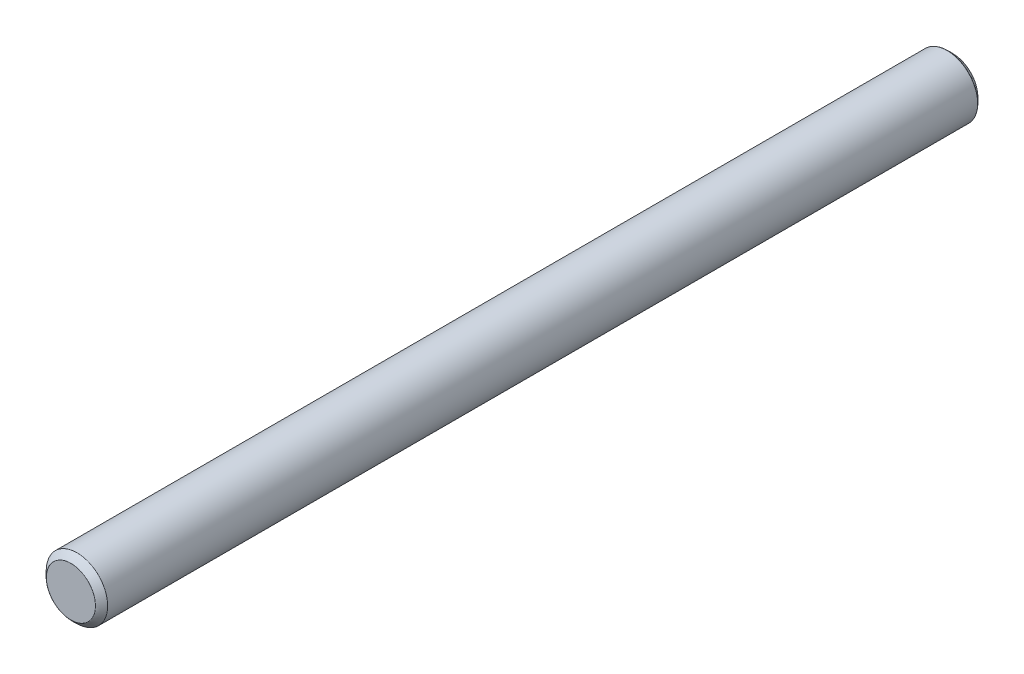
ISO-10303-21;
HEADER;
FILE_DESCRIPTION(('STEP AP214'),'2;1');
FILE_NAME('part.step','',(''),(''),'','','');
FILE_SCHEMA(('AUTOMOTIVE_DESIGN { 1 0 10303 214 1 1 1 1 }'));
ENDSEC;
DATA;
#1=APPLICATION_CONTEXT('core data for automotive mechanical design processes');
#2=APPLICATION_PROTOCOL_DEFINITION('international standard','automotive_design',2000,#1);
#3=PRODUCT_CONTEXT('',#1,'mechanical');
#4=PRODUCT('Part','Part','',(#3));
#5=PRODUCT_RELATED_PRODUCT_CATEGORY('part','',(#4));
#6=PRODUCT_DEFINITION_FORMATION('','',#4);
#7=PRODUCT_DEFINITION_CONTEXT('part definition',#1,'design');
#8=PRODUCT_DEFINITION('design','',#6,#7);
#9=PRODUCT_DEFINITION_SHAPE('','',#8);
#10=(LENGTH_UNIT() NAMED_UNIT(*) SI_UNIT(.MILLI.,.METRE.));
#11=(NAMED_UNIT(*) PLANE_ANGLE_UNIT() SI_UNIT($,.RADIAN.));
#12=(NAMED_UNIT(*) SI_UNIT($,.STERADIAN.) SOLID_ANGLE_UNIT());
#13=UNCERTAINTY_MEASURE_WITH_UNIT(LENGTH_MEASURE(1.E-05),#10,'distance_accuracy_value','');
#14=(GEOMETRIC_REPRESENTATION_CONTEXT(3) GLOBAL_UNCERTAINTY_ASSIGNED_CONTEXT((#13)) GLOBAL_UNIT_ASSIGNED_CONTEXT((#10,
#11,#12)) REPRESENTATION_CONTEXT('',''));
#15=CARTESIAN_POINT('',(0.,0.,0.));
#16=DIRECTION('',(0.,0.,1.));
#17=DIRECTION('',(1.,0.,0.));
#18=AXIS2_PLACEMENT_3D('',#15,#16,#17);
#19=CARTESIAN_POINT('',(21.0000003129244,21.0000003129244,0.));
#20=DIRECTION('',(0.,0.,1.));
#21=DIRECTION('',(1.,0.,0.));
#22=AXIS2_PLACEMENT_3D('',#19,#20,#21);
#23=PLANE('',#22);
#24=CARTESIAN_POINT('',(19.0000003129238,21.0000003129243,0.));
#25=CARTESIAN_POINT('',(19.0000003129238,20.7008024610567,0.));
#26=CARTESIAN_POINT('',(19.1368379382517,20.1028116455905,0.));
#27=CARTESIAN_POINT('',(19.7103267658874,19.3826510640446,0.));
#28=CARTESIAN_POINT('',(20.5397550038727,18.9836402178783,0.));
#29=CARTESIAN_POINT('',(21.4603736935143,18.9832834513304,0.));
#30=CARTESIAN_POINT('',(22.2895292086346,19.3828951034981,0.));
#31=CARTESIAN_POINT('',(22.8637622890839,20.1025187758078,0.));
#32=CARTESIAN_POINT('',(23.0681217289901,20.9999654872141,0.));
#33=CARTESIAN_POINT('',(22.86393551835,21.8976061113134,0.));
#34=CARTESIAN_POINT('',(22.2894703279759,22.6168740574728,0.));
#35=CARTESIAN_POINT('',(21.4603797789991,23.0167114218665,0.));
#36=CARTESIAN_POINT('',(20.5398701973034,23.0162109402336,0.));
#37=CARTESIAN_POINT('',(19.7103040674624,22.6174206357461,0.));
#38=CARTESIAN_POINT('',(19.1368244429707,21.8972478306236,0.));
#39=CARTESIAN_POINT('',(19.0000003129244,21.2991981647919,0.));
#40=CARTESIAN_POINT('',(19.0000003129238,21.0000003129243,0.));
#41=(BOUNDED_CURVE() B_SPLINE_CURVE(3,(#24,#25,#26,#27,#28,#29,#30,#31,#32,#33,#34,#35,#36,#37,
#38,#39,#40),.UNSPECIFIED.,.T.,.F.) B_SPLINE_CURVE_WITH_KNOTS((4,1,1,1,1,1,1,1,1,1,1,1,1,1,4),
(0.,0.0893513490095413,0.178702698019083,0.268054047028624,0.357405396038165,0.446756745047706,
0.536108094057248,0.625459443066789,0.71481079207633,0.804162141085872,0.893513490095413,
0.982864839104954,1.0722161881145,1.16156753712404,1.25091888613358),
.UNSPECIFIED.) CURVE() GEOMETRIC_REPRESENTATION_ITEM() RATIONAL_B_SPLINE_CURVE((1.,1.,1.,1.,1.,
1.,1.,1.,1.,1.,1.,1.,1.,1.,1.,1.,1.)) REPRESENTATION_ITEM(''));
#42=CARTESIAN_POINT('',(19.0000003129238,21.0000003129243,0.));
#43=VERTEX_POINT('',#42);
#44=EDGE_CURVE('E11',#43,#43,#41,.T.);
#45=ORIENTED_EDGE('',*,*,#44,.F.);
#46=EDGE_LOOP('',(#45));
#47=FACE_BOUND('',#46,.T.);
#48=ADVANCED_FACE('F17',(#47),#23,.F.);
#49=CARTESIAN_POINT('',(18.5000003129244,21.0000003129244,0.5));
#50=CARTESIAN_POINT('',(18.5000003129244,20.6260029980899,0.5));
#51=CARTESIAN_POINT('',(18.6710473445843,19.8785144787572,0.5));
#52=CARTESIAN_POINT('',(19.3879083791285,18.9783137518249,0.5));
#53=CARTESIAN_POINT('',(20.4246936766101,18.479550194117,0.5));
#54=CARTESIAN_POINT('',(21.5754670386619,18.479104235932,0.5));
#55=CARTESIAN_POINT('',(22.6119114325621,18.9786188011417,0.5));
#56=CARTESIAN_POINT('',(23.3297027831237,19.8781483915288,0.5));
#57=CARTESIAN_POINT('',(23.5851520830064,20.9999567807866,0.5));
#58=CARTESIAN_POINT('',(23.3299193197063,22.1220075609106,0.5));
#59=CARTESIAN_POINT('',(22.6118378317387,23.0210924936098,0.5));
#60=CARTESIAN_POINT('',(21.5754746455178,23.5208891991021,0.5));
#61=CARTESIAN_POINT('',(20.4248376683982,23.5202635970609,0.5));
#62=CARTESIAN_POINT('',(19.3878800060969,23.0217757164516,0.5));
#63=CARTESIAN_POINT('',(18.6710304754823,22.1215597100484,0.5));
#64=CARTESIAN_POINT('',(18.5000003129244,21.3739976277588,0.5));
#65=CARTESIAN_POINT('',(18.5000003129244,21.0000003129244,0.5));
#66=CARTESIAN_POINT('',(18.5000003129244,21.0000003129244,0.493265649702988));
#67=CARTESIAN_POINT('',(18.5000003129244,20.6263840707956,0.493265649702988));
#68=CARTESIAN_POINT('',(18.671314938168,19.8791590527189,0.493265649702988));
#69=CARTESIAN_POINT('',(19.3883444127851,18.979466115803,0.493265649702987));
#70=CARTESIAN_POINT('',(20.4244140424163,18.4808899410724,0.493265649702987));
#71=CARTESIAN_POINT('',(21.5748857404242,18.480618990635,0.493265649702987));
#72=CARTESIAN_POINT('',(22.6106749790101,18.9795685281252,0.493265649702987));
#73=CARTESIAN_POINT('',(23.3280138629895,19.8788332526671,0.493265649702987));
#74=CARTESIAN_POINT('',(23.5836564186189,20.9999810500944,0.493265649702987));
#75=CARTESIAN_POINT('',(23.3282441566848,22.1212878624697,0.493265649702987));
#76=CARTESIAN_POINT('',(22.6108504037107,23.0200236085121,0.493265649702986));
#77=CARTESIAN_POINT('',(21.5747476839077,23.519264272477,0.493265649702986));
#78=CARTESIAN_POINT('',(20.4246638664434,23.5189357417867,0.493265649702986));
#79=CARTESIAN_POINT('',(19.3882174119512,23.0205025962556,0.493265649702986));
#80=CARTESIAN_POINT('',(18.6712531071615,22.1208706536084,0.493265649702986));
#81=CARTESIAN_POINT('',(18.5000003129244,21.3736165550532,0.493265649702986));
#82=CARTESIAN_POINT('',(18.5000003129244,21.0000003129244,0.493265649702988));
#83=CARTESIAN_POINT('',(18.5236598250269,21.0000003129244,0.450318965022027));
#84=CARTESIAN_POINT('',(18.5236598250269,20.6293649869712,0.450318965022027));
#85=CARTESIAN_POINT('',(18.692963494455,19.888827852217,0.450318965022028));
#86=CARTESIAN_POINT('',(19.4029618609725,18.9969099939135,0.450318965022026));
#87=CARTESIAN_POINT('',(20.4302684796254,18.5027793812064,0.450318965022025));
#88=CARTESIAN_POINT('',(21.5702916187756,18.5022561501092,0.450318965022024));
#89=CARTESIAN_POINT('',(22.5972323820784,18.9973065153958,0.450318965022023));
#90=CARTESIAN_POINT('',(23.308441389072,19.888446469609,0.450318965022024));
#91=CARTESIAN_POINT('',(23.5613831759737,20.9999458916222,0.450318965022023));
#92=CARTESIAN_POINT('',(23.3086494703154,22.111724235042,0.450318965022023));
#93=CARTESIAN_POINT('',(22.5970435176181,23.0024630041963,0.450318965022022));
#94=CARTESIAN_POINT('',(21.5703669826366,23.4977886551724,0.450318965022021));
#95=CARTESIAN_POINT('',(20.4303618273069,23.4970306407079,0.450318965022021));
#96=CARTESIAN_POINT('',(19.4029796830664,23.0032348644094,0.450318965022021));
#97=CARTESIAN_POINT('',(18.6929677217708,22.1112663539273,0.45031896502202));
#98=CARTESIAN_POINT('',(18.523659825027,21.3706356388776,0.45031896502202));
#99=CARTESIAN_POINT('',(18.5236598250269,21.0000003129244,0.450318965022027));
#100=CARTESIAN_POINT('',(18.7488163916972,21.0000003129243,0.214278353263149));
#101=CARTESIAN_POINT('',(18.7488163916972,20.6632302218525,0.214278353263149));
#102=CARTESIAN_POINT('',(18.9028429567965,19.9901397521042,0.214278353263151));
#103=CARTESIAN_POINT('',(19.5483594064419,19.1795389282869,0.214278353263145));
#104=CARTESIAN_POINT('',(20.4819485135029,18.7304177923445,0.214278353263145));
#105=CARTESIAN_POINT('',(21.5181858634594,18.73001833392,0.214278353263141));
#106=CARTESIAN_POINT('',(22.4514687272071,19.1798111680745,0.21427835326314));
#107=CARTESIAN_POINT('',(23.0978153975937,19.9898105871399,0.214278353263141));
#108=CARTESIAN_POINT('',(23.3278430759055,20.9999614067024,0.214278353263139));
#109=CARTESIAN_POINT('',(23.0980105493306,22.0103294851565,0.214278353263139));
#110=CARTESIAN_POINT('',(22.4514054613194,22.8199274826304,0.214278353263137));
#111=CARTESIAN_POINT('',(21.5181909527529,23.2699744852586,0.214278353263136));
#112=CARTESIAN_POINT('',(20.4820794533847,23.2694147375436,0.214278353263135));
#113=CARTESIAN_POINT('',(19.548332665267,22.820540238367,0.214278353263135));
#114=CARTESIAN_POINT('',(18.9028272232094,22.00992657763,0.214278353263133));
#115=CARTESIAN_POINT('',(18.7488163916974,21.3367704039963,0.214278353263133));
#116=CARTESIAN_POINT('',(18.7488163916972,21.0000003129243,0.214278353263149));
#117=CARTESIAN_POINT('',(18.9126541124237,21.0000003129243,0.0624472864865153));
#118=CARTESIAN_POINT('',(18.9126541124237,20.6878314682075,0.0624472864865157));
#119=CARTESIAN_POINT('',(19.0555352066121,20.0637908555202,0.0624472864865174));
#120=CARTESIAN_POINT('',(19.6541124607825,19.3123064246963,0.0624472864865128));
#121=CARTESIAN_POINT('',(20.5195842885476,18.8959166966965,0.062447286486512));
#122=CARTESIAN_POINT('',(21.4803333304375,18.8955883934135,0.0624472864865088));
#123=CARTESIAN_POINT('',(22.3455357539319,19.3125101242643,0.0624472864865081));
#124=CARTESIAN_POINT('',(22.9447335005759,20.0634953343182,0.0624472864865088));
#125=CARTESIAN_POINT('',(23.1580665876456,20.9999700741472,0.0624472864865077));
#126=CARTESIAN_POINT('',(22.9449177575668,21.9366262121409,0.0624472864865075));
#127=CARTESIAN_POINT('',(22.3455369742626,22.6872189392819,0.0624472864865057));
#128=CARTESIAN_POINT('',(21.4803030224549,23.104378501475,0.0624472864865049));
#129=CARTESIAN_POINT('',(20.5197311477327,23.1039309264867,0.0624472864865042));
#130=CARTESIAN_POINT('',(19.6540639492941,22.6877379882818,0.0624472864865044));
#131=CARTESIAN_POINT('',(19.0555098063449,21.9362599959242,0.0624472864865027));
#132=CARTESIAN_POINT('',(18.9126541124242,21.3121691576412,0.0624472864865024));
#133=CARTESIAN_POINT('',(18.9126541124237,21.0000003129243,0.0624472864865153));
#134=CARTESIAN_POINT('',(18.9801906978812,21.0000003129243,0.00766778343289825));
#135=CARTESIAN_POINT('',(18.9801906978812,20.6978546538713,0.00766778343289845));
#136=CARTESIAN_POINT('',(19.1183946912095,20.0939517036443,0.00766778343289932));
#137=CARTESIAN_POINT('',(19.6975707505,19.3666789774475,0.00766778343289697));
#138=CARTESIAN_POINT('',(20.5351848492648,18.9637237207908,0.00766778343289658));
#139=CARTESIAN_POINT('',(21.4649096693812,18.963370626152,0.00766778343289498));
#140=CARTESIAN_POINT('',(22.3022508355027,19.3669170908698,0.00766778343289464));
#141=CARTESIAN_POINT('',(22.8821529546303,20.0936575917911,0.00766778343289497));
#142=CARTESIAN_POINT('',(23.0885444923939,20.999966141515,0.00766778343289446));
#143=CARTESIAN_POINT('',(22.8823284661221,21.906467091754,0.00766778343289431));
#144=CARTESIAN_POINT('',(22.3022016247976,22.632844871376,0.00766778343289341));
#145=CARTESIAN_POINT('',(21.4649098177277,23.0366196539455,0.00766778343289301));
#146=CARTESIAN_POINT('',(20.5353055411066,23.0361264464894,0.00766778343289268));
#147=CARTESIAN_POINT('',(19.6975437664382,22.633388454408,0.00766778343289278));
#148=CARTESIAN_POINT('',(19.1183792110389,21.9061065239894,0.0076677834328919));
#149=CARTESIAN_POINT('',(18.9801906978818,21.3021459719774,0.00766778343289177));
#150=CARTESIAN_POINT('',(18.9801906978812,21.0000003129243,0.00766778343289825));
#151=CARTESIAN_POINT('',(18.9966331377753,21.0000003129243,0.));
#152=CARTESIAN_POINT('',(18.9966331377753,20.7003345813642,0.));
#153=CARTESIAN_POINT('',(19.1337263127628,20.1013617825753,0.));
#154=CARTESIAN_POINT('',(19.7081965035942,19.3800365135426,0.));
#155=CARTESIAN_POINT('',(20.53895383644,18.9803715240939,0.));
#156=CARTESIAN_POINT('',(21.4610940918526,18.9800306192266,0.));
#157=CARTESIAN_POINT('',(22.2915839348698,19.3802619025489,0.));
#158=CARTESIAN_POINT('',(22.8667412251483,20.1010722093858,0.));
#159=CARTESIAN_POINT('',(23.0714629009181,20.9999677115056,0.));
#160=CARTESIAN_POINT('',(22.8669160401415,21.8990496099246,0.));
#161=CARTESIAN_POINT('',(22.2915483799859,22.6194956599697,0.));
#162=CARTESIAN_POINT('',(21.4610864855708,23.019953880822,0.));
#163=CARTESIAN_POINT('',(20.5390791790543,23.0194805009823,0.));
#164=CARTESIAN_POINT('',(19.7081644894037,22.6200239468188,0.));
#165=CARTESIAN_POINT('',(19.1337085653621,21.898693608417,0.));
#166=CARTESIAN_POINT('',(18.9966331377759,21.2996660444845,0.));
#167=CARTESIAN_POINT('',(18.9966331377753,21.0000003129243,0.));
#168=CARTESIAN_POINT('',(19.0000003129238,21.0000003129243,0.));
#169=CARTESIAN_POINT('',(19.0000003129238,20.7008024610567,0.));
#170=CARTESIAN_POINT('',(19.1368379382517,20.1028116455905,0.));
#171=CARTESIAN_POINT('',(19.7103267658874,19.3826510640446,0.));
#172=CARTESIAN_POINT('',(20.5397550038727,18.9836402178783,0.));
#173=CARTESIAN_POINT('',(21.4603736935143,18.9832834513304,0.));
#174=CARTESIAN_POINT('',(22.2895292086346,19.3828951034981,0.));
#175=CARTESIAN_POINT('',(22.8637622890839,20.1025187758078,0.));
#176=CARTESIAN_POINT('',(23.0681217289901,20.9999654872141,0.));
#177=CARTESIAN_POINT('',(22.86393551835,21.8976061113134,0.));
#178=CARTESIAN_POINT('',(22.2894703279759,22.6168740574728,0.));
#179=CARTESIAN_POINT('',(21.4603797789991,23.0167114218665,0.));
#180=CARTESIAN_POINT('',(20.5398701973034,23.0162109402336,0.));
#181=CARTESIAN_POINT('',(19.7103040674624,22.6174206357461,0.));
#182=CARTESIAN_POINT('',(19.1368244429707,21.8972478306236,0.));
#183=CARTESIAN_POINT('',(19.0000003129244,21.2991981647919,0.));
#184=CARTESIAN_POINT('',(19.0000003129238,21.0000003129243,0.));
#185=(BOUNDED_SURFACE() B_SPLINE_SURFACE(3,3,((#49,#50,#51,#52,#53,#54,#55,#56,#57,#58,#59,#60,
#61,#62,#63,#64,#65),(#66,#67,#68,#69,#70,#71,#72,#73,#74,#75,#76,#77,#78,#79,#80,#81,#82),(#83,
#84,#85,#86,#87,#88,#89,#90,#91,#92,#93,#94,#95,#96,#97,#98,#99),(#100,#101,#102,#103,#104,#105,
#106,#107,#108,#109,#110,#111,#112,#113,#114,#115,#116),(#117,#118,#119,#120,#121,#122,#123,
#124,#125,#126,#127,#128,#129,#130,#131,#132,#133),(#134,#135,#136,#137,#138,#139,#140,#141,
#142,#143,#144,#145,#146,#147,#148,#149,#150),(#151,#152,#153,#154,#155,#156,#157,#158,#159,
#160,#161,#162,#163,#164,#165,#166,#167),(#168,#169,#170,#171,#172,#173,#174,#175,#176,#177,
#178,#179,#180,#181,#182,#183,#184)),.UNSPECIFIED.,.F.,.T.,.F.) B_SPLINE_SURFACE_WITH_KNOTS((4,
1,1,1,1,4),(4,1,1,1,1,1,1,1,1,1,1,1,1,1,4),(0.,0.285714285714286,0.571428571428571,
0.678571428571428,0.857142857142857,1.),(0.,0.0893513490095413,0.178702698019083,
0.268054047028624,0.357405396038165,0.446756745047706,0.536108094057248,0.625459443066789,
0.71481079207633,0.804162141085872,0.893513490095413,0.982864839104954,1.0722161881145,
1.16156753712404,1.25091888613358),
.UNSPECIFIED.) GEOMETRIC_REPRESENTATION_ITEM() RATIONAL_B_SPLINE_SURFACE(((1.,1.,1.,1.,1.,1.,1.,
1.,1.,1.,1.,1.,1.,1.,1.,1.,1.),(1.,1.,1.,1.,1.,1.,1.,1.,1.,1.,1.,1.,1.,1.,1.,1.,1.),(1.,1.,1.,
1.,1.,1.,1.,1.,1.,1.,1.,1.,1.,1.,1.,1.,1.),(1.,1.,1.,1.,1.,1.,1.,1.,1.,1.,1.,1.,1.,1.,1.,1.,1.),
(1.,1.,1.,1.,1.,1.,1.,1.,1.,1.,1.,1.,1.,1.,1.,1.,1.),(1.,1.,1.,1.,1.,1.,1.,1.,1.,1.,1.,1.,1.,1.,
1.,1.,1.),(1.,1.,1.,1.,1.,1.,1.,1.,1.,1.,1.,1.,1.,1.,1.,1.,1.),(1.,1.,1.,1.,1.,1.,1.,1.,1.,1.,
1.,1.,1.,1.,1.,1.,1.))) REPRESENTATION_ITEM('') SURFACE());
#186=CARTESIAN_POINT('',(18.5000003129244,21.0000003129244,0.5));
#187=CARTESIAN_POINT('',(18.5000003129244,21.0000003129244,0.493265649702988));
#188=CARTESIAN_POINT('',(18.5236598250269,21.0000003129244,0.450318965022027));
#189=CARTESIAN_POINT('',(18.7488163916972,21.0000003129243,0.214278353263149));
#190=CARTESIAN_POINT('',(18.9126541124237,21.0000003129243,0.0624472864865153));
#191=CARTESIAN_POINT('',(18.9801906978812,21.0000003129243,0.00766778343289825));
#192=CARTESIAN_POINT('',(18.9966331377753,21.0000003129243,0.));
#193=CARTESIAN_POINT('',(19.0000003129238,21.0000003129243,0.));
#194=(BOUNDED_CURVE() B_SPLINE_CURVE(3,(#186,#187,#188,#189,#190,#191,#192,#193),.UNSPECIFIED.,
.F.,.F.) B_SPLINE_CURVE_WITH_KNOTS((4,1,1,1,1,4),(0.,0.285714285714286,0.571428571428571,
0.678571428571428,0.857142857142857,1.),
.UNSPECIFIED.) CURVE() GEOMETRIC_REPRESENTATION_ITEM() RATIONAL_B_SPLINE_CURVE((1.,1.,1.,1.,1.,
1.,1.,1.)) REPRESENTATION_ITEM(''));
#195=CARTESIAN_POINT('',(18.5000003129244,21.0000003129244,0.5));
#196=VERTEX_POINT('',#195);
#197=EDGE_CURVE('E32',#196,#43,#194,.T.);
#198=CARTESIAN_POINT('',(18.5000003129244,21.0000003129244,0.5));
#199=CARTESIAN_POINT('',(18.5000003129244,21.3739976277588,0.5));
#200=CARTESIAN_POINT('',(18.6710304754823,22.1215597100484,0.5));
#201=CARTESIAN_POINT('',(19.3878800060969,23.0217757164516,0.5));
#202=CARTESIAN_POINT('',(20.4248376683982,23.5202635970609,0.5));
#203=CARTESIAN_POINT('',(21.5754746455178,23.5208891991021,0.5));
#204=CARTESIAN_POINT('',(22.6118378317387,23.0210924936098,0.5));
#205=CARTESIAN_POINT('',(23.3299193197063,22.1220075609106,0.5));
#206=CARTESIAN_POINT('',(23.5851520830064,20.9999567807866,0.5));
#207=CARTESIAN_POINT('',(23.3297027831237,19.8781483915288,0.5));
#208=CARTESIAN_POINT('',(22.6119114325621,18.9786188011417,0.5));
#209=CARTESIAN_POINT('',(21.5754670386619,18.479104235932,0.5));
#210=CARTESIAN_POINT('',(20.4246936766101,18.479550194117,0.5));
#211=CARTESIAN_POINT('',(19.3879083791285,18.9783137518249,0.5));
#212=CARTESIAN_POINT('',(18.6710473445843,19.8785144787572,0.5));
#213=CARTESIAN_POINT('',(18.5000003129244,20.6260029980899,0.5));
#214=CARTESIAN_POINT('',(18.5000003129244,21.0000003129244,0.5));
#215=(BOUNDED_CURVE() B_SPLINE_CURVE(3,(#198,#199,#200,#201,#202,#203,#204,#205,#206,#207,#208,
#209,#210,#211,#212,#213,#214),.UNSPECIFIED.,.T.,.F.) B_SPLINE_CURVE_WITH_KNOTS((4,1,1,1,1,1,1,
1,1,1,1,1,1,1,4),(0.,0.0893513490095401,0.17870269801908,0.268054047028626,0.357405396038167,
0.446756745047708,0.53610809405725,0.625459443066791,0.714810792076332,0.804162141085874,
0.893513490095415,0.982864839104956,1.0722161881145,1.16156753712404,1.25091888613358),
.UNSPECIFIED.) CURVE() GEOMETRIC_REPRESENTATION_ITEM() RATIONAL_B_SPLINE_CURVE((1.,1.,1.,1.,1.,
1.,1.,1.,1.,1.,1.,1.,1.,1.,1.,1.,1.)) REPRESENTATION_ITEM(''));
#216=EDGE_CURVE('E73',#196,#196,#215,.T.);
#217=ORIENTED_EDGE('',*,*,#197,.T.);
#218=ORIENTED_EDGE('',*,*,#44,.T.);
#219=ORIENTED_EDGE('',*,*,#197,.F.);
#220=ORIENTED_EDGE('',*,*,#216,.T.);
#221=EDGE_LOOP('',(#217,#218,#219,#220));
#222=FACE_BOUND('',#221,.T.);
#223=ADVANCED_FACE('F19',(#222),#185,.T.);
#224=CARTESIAN_POINT('',(21.0000003129244,21.0000003129244,72.));
#225=DIRECTION('',(0.,0.,1.));
#226=DIRECTION('',(1.,0.,0.));
#227=AXIS2_PLACEMENT_3D('',#224,#225,#226);
#228=PLANE('',#227);
#229=CARTESIAN_POINT('',(19.0000003129244,21.0000003129244,72.));
#230=CARTESIAN_POINT('',(19.0000003129244,21.2991981647919,72.));
#231=CARTESIAN_POINT('',(19.1368741978015,21.8972522969943,72.));
#232=CARTESIAN_POINT('',(19.7105374187865,22.617351745074,72.));
#233=CARTESIAN_POINT('',(20.5399713079291,23.016237614698,72.));
#234=CARTESIAN_POINT('',(21.4609284213258,23.016757161866,72.));
#235=CARTESIAN_POINT('',(22.2891381014953,22.6168869812491,72.));
#236=CARTESIAN_POINT('',(22.961581456596,21.777626186805,72.));
#237=CARTESIAN_POINT('',(23.0673635611257,20.8354924298796,72.));
#238=CARTESIAN_POINT('',(22.7670361183784,19.9825947355451,72.));
#239=CARTESIAN_POINT('',(22.2897404072571,19.3829333990063,72.));
#240=CARTESIAN_POINT('',(21.4599815986874,18.9832564078411,72.));
#241=CARTESIAN_POINT('',(20.5398190020859,18.9838300957637,72.));
#242=CARTESIAN_POINT('',(19.7102191022599,19.3826601462782,72.));
#243=CARTESIAN_POINT('',(19.1368351197878,20.1027627200534,72.));
#244=CARTESIAN_POINT('',(19.000000312924,20.7008024610568,72.));
#245=CARTESIAN_POINT('',(19.0000003129244,21.0000003129244,72.));
#246=(BOUNDED_CURVE() B_SPLINE_CURVE(3,(#229,#230,#231,#232,#233,#234,#235,#236,#237,#238,#239,
#240,#241,#242,#243,#244,#245),.UNSPECIFIED.,.T.,.F.) B_SPLINE_CURVE_WITH_KNOTS((4,1,1,1,1,1,1,
1,1,1,1,1,1,1,4),(-1.25091888613358,-1.16156753712404,-1.0722161881145,-0.982864839104954,
-0.893513490095413,-0.804162141085872,-0.71481079207633,-0.580783768562018,-0.536108094057248,
-0.446756745047706,-0.357405396038165,-0.268054047028624,-0.178702698019083,-0.0893513490095413,
0.),.UNSPECIFIED.) CURVE() GEOMETRIC_REPRESENTATION_ITEM() RATIONAL_B_SPLINE_CURVE((1.,1.,1.,1.,
1.,1.,1.,1.,1.,1.,1.,1.,1.,1.,1.,1.,1.)) REPRESENTATION_ITEM(''));
#247=CARTESIAN_POINT('',(19.0000003129244,21.0000003129244,72.));
#248=VERTEX_POINT('',#247);
#249=EDGE_CURVE('E58',#248,#248,#246,.T.);
#250=ORIENTED_EDGE('',*,*,#249,.F.);
#251=EDGE_LOOP('',(#250));
#252=FACE_BOUND('',#251,.T.);
#253=ADVANCED_FACE('F109',(#252),#228,.T.);
#254=CARTESIAN_POINT('',(21.0000003129244,21.0000003129244,0.));
#255=DIRECTION('',(0.,0.,1.));
#256=DIRECTION('',(1.,0.,0.));
#257=AXIS2_PLACEMENT_3D('',#254,#255,#256);
#258=CYLINDRICAL_SURFACE('',#257,2.5);
#259=CARTESIAN_POINT('',(18.5000003129244,21.0000003129244,71.5));
#260=CARTESIAN_POINT('',(18.5000003129244,20.62600299809,71.5));
#261=CARTESIAN_POINT('',(18.6710438215041,19.8784533218358,71.5));
#262=CARTESIAN_POINT('',(19.3877737995941,18.9783251046168,71.5));
#263=CARTESIAN_POINT('',(20.4247736743766,18.4797875414736,71.5));
#264=CARTESIAN_POINT('',(21.5749769201283,18.4790704315703,71.5));
#265=CARTESIAN_POINT('',(22.6121754308404,18.9786666705268,71.5));
#266=CARTESIAN_POINT('',(23.208795069742,19.7282433412004,71.5));
#267=CARTESIAN_POINT('',(23.584204373176,20.7943654591185,71.5));
#268=CARTESIAN_POINT('',(23.451976742514,21.9720326552752,71.5));
#269=CARTESIAN_POINT('',(22.611422548638,23.0211086483304,71.5));
#270=CARTESIAN_POINT('',(21.5761604484262,23.5209463741015,71.5));
#271=CARTESIAN_POINT('',(20.4249640566803,23.5202969401414,71.5));
#272=CARTESIAN_POINT('',(19.3881716952521,23.0216896031114,71.5));
#273=CARTESIAN_POINT('',(18.6710926690208,22.1215652930118,71.5));
#274=CARTESIAN_POINT('',(18.5000003129244,21.3739976277588,71.5));
#275=CARTESIAN_POINT('',(18.5000003129244,21.0000003129244,71.5));
#276=(BOUNDED_CURVE() B_SPLINE_CURVE(3,(#259,#260,#261,#262,#263,#264,#265,#266,#267,#268,#269,
#270,#271,#272,#273,#274,#275),.UNSPECIFIED.,.T.,.F.) B_SPLINE_CURVE_WITH_KNOTS((4,1,1,1,1,1,1,
1,1,1,1,1,1,1,4),(0.,0.0893513490095413,0.178702698019083,0.268054047028624,0.357405396038165,
0.446756745047706,0.536108094057248,0.580783768562018,0.71481079207633,0.804162141085872,
0.893513490095413,0.982864839104954,1.0722161881145,1.16156753712404,1.25091888613358),
.UNSPECIFIED.) CURVE() GEOMETRIC_REPRESENTATION_ITEM() RATIONAL_B_SPLINE_CURVE((1.,1.,1.,1.,1.,
1.,1.,1.,1.,1.,1.,1.,1.,1.,1.,1.,1.)) REPRESENTATION_ITEM(''));
#277=CARTESIAN_POINT('',(18.5000003129244,21.0000003129244,71.5));
#278=VERTEX_POINT('',#277);
#279=EDGE_CURVE('E65',#278,#278,#276,.T.);
#280=ORIENTED_EDGE('',*,*,#279,.F.);
#281=DIRECTION('',(0.,0.,-1.));
#282=VECTOR('',#281,1.);
#283=CARTESIAN_POINT('',(18.5000003129244,21.0000003129244,0.));
#284=LINE('',#283,#282);
#285=EDGE_CURVE('E64',#278,#196,#284,.T.);
#286=ORIENTED_EDGE('',*,*,#285,.T.);
#287=ORIENTED_EDGE('',*,*,#216,.F.);
#288=ORIENTED_EDGE('',*,*,#285,.F.);
#289=EDGE_LOOP('',(#280,#286,#287,#288));
#290=FACE_BOUND('',#289,.T.);
#291=ADVANCED_FACE('F100',(#290),#258,.T.);
#292=CARTESIAN_POINT('',(19.000000312924,21.0000003129244,72.));
#293=CARTESIAN_POINT('',(19.000000312924,20.7008024610568,72.));
#294=CARTESIAN_POINT('',(19.1368351197878,20.1027627200534,72.));
#295=CARTESIAN_POINT('',(19.7102191022599,19.3826601462782,72.));
#296=CARTESIAN_POINT('',(20.5398190020859,18.9838300957637,72.));
#297=CARTESIAN_POINT('',(21.4599815986874,18.9832564078411,72.));
#298=CARTESIAN_POINT('',(22.2897404072571,19.3829333990063,72.));
#299=CARTESIAN_POINT('',(22.7670361183784,19.9825947355451,72.));
#300=CARTESIAN_POINT('',(23.0673635611257,20.8354924298796,72.));
#301=CARTESIAN_POINT('',(22.961581456596,21.777626186805,72.));
#302=CARTESIAN_POINT('',(22.2891381014953,22.6168869812491,72.));
#303=CARTESIAN_POINT('',(21.4609284213258,23.016757161866,72.));
#304=CARTESIAN_POINT('',(20.5399713079291,23.016237614698,72.));
#305=CARTESIAN_POINT('',(19.7105374187865,22.617351745074,72.));
#306=CARTESIAN_POINT('',(19.1368741978015,21.8972522969943,72.));
#307=CARTESIAN_POINT('',(19.0000003129244,21.2991981647919,72.));
#308=CARTESIAN_POINT('',(19.000000312924,21.0000003129244,72.));
#309=CARTESIAN_POINT('',(18.993265962627,21.0000003129244,72.));
#310=CARTESIAN_POINT('',(18.993265962627,20.6998964687056,72.));
#311=CARTESIAN_POINT('',(19.1306058953902,20.0999857539772,72.));
#312=CARTESIAN_POINT('',(19.7058705600816,19.3776586578103,72.));
#313=CARTESIAN_POINT('',(20.5381269383792,18.9775558440418,72.));
#314=CARTESIAN_POINT('',(21.4611981803173,18.9770013371139,72.));
#315=CARTESIAN_POINT('',(22.2935401506183,19.3778794080405,72.));
#316=CARTESIAN_POINT('',(22.7723178105321,19.9794208987819,72.));
#317=CARTESIAN_POINT('',(23.0735999393266,20.8349490346416,72.));
#318=CARTESIAN_POINT('',(22.9674530320309,21.7800023576334,72.));
#319=CARTESIAN_POINT('',(22.2929298035517,22.6218933401226,72.));
#320=CARTESIAN_POINT('',(21.4620933537506,23.0229798643413,72.));
#321=CARTESIAN_POINT('',(20.5382471099923,23.0224892283945,72.));
#322=CARTESIAN_POINT('',(19.7061679208095,22.6223393342131,72.));
#323=CARTESIAN_POINT('',(19.1306377811438,21.9000242316385,72.));
#324=CARTESIAN_POINT('',(18.9932659626274,21.3001041571432,72.));
#325=CARTESIAN_POINT('',(18.993265962627,21.0000003129244,72.));
#326=CARTESIAN_POINT('',(18.9588045124277,21.0000003129244,71.9793748919848));
#327=CARTESIAN_POINT('',(18.9588045124277,20.6946569562502,71.9793748919848));
#328=CARTESIAN_POINT('',(19.0984654148407,20.0843232496863,71.9793748919848));
#329=CARTESIAN_POINT('',(19.6836513563965,19.3494222937956,71.9793748919847));
#330=CARTESIAN_POINT('',(20.5303158664397,18.9423891755859,71.9793748919847));
#331=CARTESIAN_POINT('',(21.4693994539181,18.9418072797484,71.9793748919847));
#332=CARTESIAN_POINT('',(22.3162135221999,19.3496920432878,71.9793748919847));
#333=CARTESIAN_POINT('',(22.8033191237918,19.9616813827681,71.9793748919847));
#334=CARTESIAN_POINT('',(23.1098230117441,20.8321057131127,71.9793748919847));
#335=CARTESIAN_POINT('',(23.0018605452394,21.7936022416637,71.9793748919847));
#336=CARTESIAN_POINT('',(22.3155977823453,22.650116586146,71.9793748919847));
#337=CARTESIAN_POINT('',(21.4703564056219,23.0582010163317,71.9793748919847));
#338=CARTESIAN_POINT('',(20.5304657290108,23.0576760084874,71.9793748919847));
#339=CARTESIAN_POINT('',(19.683972464333,22.6505874472683,71.9793748919847));
#340=CARTESIAN_POINT('',(19.098504045895,21.9156911954706,71.9793748919848));
#341=CARTESIAN_POINT('',(18.958804512428,21.3053436695985,71.9793748919848));
#342=CARTESIAN_POINT('',(18.9588045124277,21.0000003129244,71.9793748919848));
#343=CARTESIAN_POINT('',(18.8035291096184,21.0000003129244,71.8370737006534));
#344=CARTESIAN_POINT('',(18.8035291096184,20.6714464454432,71.8370737006534));
#345=CARTESIAN_POINT('',(18.9538216538872,20.0147083653758,71.8370737006534));
#346=CARTESIAN_POINT('',(19.5835146813463,19.2239368479599,71.8370737006534));
#347=CARTESIAN_POINT('',(20.494562422432,18.7859522913292,71.8370737006534));
#348=CARTESIAN_POINT('',(21.5050506860691,18.7853297100736,71.8370737006533));
#349=CARTESIAN_POINT('',(22.4162468401105,19.2242180591897,71.8370737006534));
#350=CARTESIAN_POINT('',(22.9403857286677,19.8827383483083,71.8370737006533));
#351=CARTESIAN_POINT('',(23.2701960215399,20.8193356218915,71.8370737006534));
#352=CARTESIAN_POINT('',(23.1540193026484,21.8539311045743,71.8370737006534));
#353=CARTESIAN_POINT('',(22.415583240828,22.775567991344,71.8370737006534));
#354=CARTESIAN_POINT('',(21.5060711356521,23.214673673743,71.8370737006534));
#355=CARTESIAN_POINT('',(20.4947181495387,23.2141139269401,71.8370737006534));
#356=CARTESIAN_POINT('',(19.5838564812215,22.7760712233065,71.8370737006534));
#357=CARTESIAN_POINT('',(18.9538619818076,21.9853062696819,71.8370737006534));
#358=CARTESIAN_POINT('',(18.8035291096186,21.3285541804056,71.8370737006534));
#359=CARTESIAN_POINT('',(18.8035291096184,21.0000003129244,71.8370737006534));
#360=CARTESIAN_POINT('',(18.6745861372303,21.0000003129244,71.708061671188));
#361=CARTESIAN_POINT('',(18.6745861372303,20.652138539594,71.708061671188));
#362=CARTESIAN_POINT('',(18.8336926746644,19.9568183794426,71.708061671188));
#363=CARTESIAN_POINT('',(19.5003615771377,19.1195849164781,71.708061671188));
#364=CARTESIAN_POINT('',(20.4649193866595,18.6558746237816,71.7080616711879));
#365=CARTESIAN_POINT('',(21.5347658843894,18.6552112738276,71.7080616711879));
#366=CARTESIAN_POINT('',(22.4994955819593,19.1198933149812,71.7080616711879));
#367=CARTESIAN_POINT('',(23.0544288611385,19.817099564397,71.7080616711879));
#368=CARTESIAN_POINT('',(23.4036118445196,20.8087276675191,71.7080616711879));
#369=CARTESIAN_POINT('',(23.2806167396101,21.9041091943923,71.7080616711879));
#370=CARTESIAN_POINT('',(22.4987942283561,22.8798895390655,71.7080616711879));
#371=CARTESIAN_POINT('',(21.5358572007382,23.3447987508409,71.7080616711879));
#372=CARTESIAN_POINT('',(20.4650907816328,23.344200015434,71.708061671188));
#373=CARTESIAN_POINT('',(19.5007278454397,22.8804263778501,71.7080616711879));
#374=CARTESIAN_POINT('',(18.8337368340148,22.0431980934621,71.708061671188));
#375=CARTESIAN_POINT('',(18.6745861372304,21.3478620862548,71.708061671188));
#376=CARTESIAN_POINT('',(18.6745861372303,21.0000003129244,71.708061671188));
#377=CARTESIAN_POINT('',(18.562704681485,21.0000003129244,71.5877092920234));
#378=CARTESIAN_POINT('',(18.562704681485,20.6354337859976,71.5877092920234));
#379=CARTESIAN_POINT('',(18.729480113642,19.9067046972413,71.5877092920234));
#380=CARTESIAN_POINT('',(19.4282084711452,19.0292524794334,71.5877092920234));
#381=CARTESIAN_POINT('',(20.4391307166165,18.5432538834678,71.5877092920234));
#382=CARTESIAN_POINT('',(21.5603908408688,18.5425652230835,71.5877092920233));
#383=CARTESIAN_POINT('',(22.5714701402446,19.0295590028131,71.5877092920234));
#384=CARTESIAN_POINT('',(23.1530634739699,19.7602660891443,71.5877092920233));
#385=CARTESIAN_POINT('',(23.5190288212706,20.7995283599003,71.5877092920234));
#386=CARTESIAN_POINT('',(23.3901134207318,21.9475323390603,71.5877092920234));
#387=CARTESIAN_POINT('',(22.5707331615709,22.9701986621422,71.5877092920234));
#388=CARTESIAN_POINT('',(21.5615175076261,23.4574351139336,71.5877092920234));
#389=CARTESIAN_POINT('',(20.4393001443842,23.4568171638749,71.5877092920234));
#390=CARTESIAN_POINT('',(19.4285854703123,22.9707549679916,71.5877092920234));
#391=CARTESIAN_POINT('',(18.7295241063874,22.093310948891,71.5877092920234));
#392=CARTESIAN_POINT('',(18.562704681485,21.3645668398512,71.5877092920234));
#393=CARTESIAN_POINT('',(18.562704681485,21.0000003129244,71.5877092920234));
#394=CARTESIAN_POINT('',(18.5067846622719,21.0000003129244,71.5187069696387));
#395=CARTESIAN_POINT('',(18.5067846622719,20.6270124353021,71.5187069696387));
#396=CARTESIAN_POINT('',(18.6773616000908,19.8814836852305,71.5187069696387));
#397=CARTESIAN_POINT('',(19.3921492672419,18.9837873411957,71.5187069696387));
#398=CARTESIAN_POINT('',(20.4263424091957,18.4865988795839,71.5187069696387));
#399=CARTESIAN_POINT('',(21.573434575399,18.4858825724469,71.5187069696386));
#400=CARTESIAN_POINT('',(22.6078298134187,18.9841308730951,71.5187069696387));
#401=CARTESIAN_POINT('',(23.2028371610875,19.7316809153921,71.5187069696386));
#402=CARTESIAN_POINT('',(23.5772307646725,20.7949229282907,71.5187069696386));
#403=CARTESIAN_POINT('',(23.4453624319495,21.9694079296763,71.5187069696387));
#404=CARTESIAN_POINT('',(22.6070792999681,23.0156476036678,71.5187069696387));
#405=CARTESIAN_POINT('',(21.5746178614294,23.5141359444649,71.5187069696387));
#406=CARTESIAN_POINT('',(20.4265340427375,23.5134866125822,71.5187069696387));
#407=CARTESIAN_POINT('',(19.3925472759424,23.0162280830408,71.5187069696387));
#408=CARTESIAN_POINT('',(18.6774107116448,22.118535155883,71.5187069696387));
#409=CARTESIAN_POINT('',(18.506784662272,21.3729881905467,71.5187069696387));
#410=CARTESIAN_POINT('',(18.5067846622719,21.0000003129244,71.5187069696387));
#411=CARTESIAN_POINT('',(18.5000003129244,21.0000003129244,71.5033671751485));
#412=CARTESIAN_POINT('',(18.5000003129244,20.626058499609,71.5033671751485));
#413=CARTESIAN_POINT('',(18.6710680983474,19.8785869017965,71.5033671751485));
#414=CARTESIAN_POINT('',(19.3877707236623,18.9785681945764,71.5033671751485));
#415=CARTESIAN_POINT('',(20.4246956934137,18.4800690152903,71.5033671751485));
#416=CARTESIAN_POINT('',(21.5747951652471,18.4793634547273,71.5033671751484));
#417=CARTESIAN_POINT('',(22.6118783715653,18.97888053658,71.5033671751485));
#418=CARTESIAN_POINT('',(23.2084295277264,19.7283811639276,71.5033671751484));
#419=CARTESIAN_POINT('',(23.5838078860334,20.7943712202584,71.5033671751485));
#420=CARTESIAN_POINT('',(23.4515755421958,21.9719001466016,71.5033671751485));
#421=CARTESIAN_POINT('',(22.6111221999259,23.0208690579657,71.5033671751485));
#422=CARTESIAN_POINT('',(21.575948695732,23.5206356206077,71.5033671751485));
#423=CARTESIAN_POINT('',(20.4248682166998,23.5200029590158,71.5033671751485));
#424=CARTESIAN_POINT('',(19.3881565694867,23.0214388890127,71.5033671751485));
#425=CARTESIAN_POINT('',(18.6711129394821,22.1214289341849,71.5033671751485));
#426=CARTESIAN_POINT('',(18.5000003129244,21.3739421262399,71.5033671751485));
#427=CARTESIAN_POINT('',(18.5000003129244,21.0000003129244,71.5033671751485));
#428=CARTESIAN_POINT('',(18.5000003129244,21.0000003129244,71.5));
#429=CARTESIAN_POINT('',(18.5000003129244,20.62600299809,71.5));
#430=CARTESIAN_POINT('',(18.6710438215041,19.8784533218358,71.5));
#431=CARTESIAN_POINT('',(19.3877737995941,18.9783251046168,71.5));
#432=CARTESIAN_POINT('',(20.4247736743766,18.4797875414736,71.5));
#433=CARTESIAN_POINT('',(21.5749769201283,18.4790704315703,71.5));
#434=CARTESIAN_POINT('',(22.6121754308404,18.9786666705268,71.5));
#435=CARTESIAN_POINT('',(23.208795069742,19.7282433412004,71.5));
#436=CARTESIAN_POINT('',(23.584204373176,20.7943654591185,71.5));
#437=CARTESIAN_POINT('',(23.451976742514,21.9720326552752,71.5));
#438=CARTESIAN_POINT('',(22.611422548638,23.0211086483304,71.5));
#439=CARTESIAN_POINT('',(21.5761604484262,23.5209463741015,71.5));
#440=CARTESIAN_POINT('',(20.4249640566803,23.5202969401414,71.5));
#441=CARTESIAN_POINT('',(19.3881716952521,23.0216896031114,71.5));
#442=CARTESIAN_POINT('',(18.6710926690208,22.1215652930118,71.5));
#443=CARTESIAN_POINT('',(18.5000003129244,21.3739976277588,71.5));
#444=CARTESIAN_POINT('',(18.5000003129244,21.0000003129244,71.5));
#445=(BOUNDED_SURFACE() B_SPLINE_SURFACE(3,3,((#292,#293,#294,#295,#296,#297,#298,#299,#300,
#301,#302,#303,#304,#305,#306,#307,#308),(#309,#310,#311,#312,#313,#314,#315,#316,#317,#318,
#319,#320,#321,#322,#323,#324,#325),(#326,#327,#328,#329,#330,#331,#332,#333,#334,#335,#336,
#337,#338,#339,#340,#341,#342),(#343,#344,#345,#346,#347,#348,#349,#350,#351,#352,#353,#354,
#355,#356,#357,#358,#359),(#360,#361,#362,#363,#364,#365,#366,#367,#368,#369,#370,#371,#372,
#373,#374,#375,#376),(#377,#378,#379,#380,#381,#382,#383,#384,#385,#386,#387,#388,#389,#390,
#391,#392,#393),(#394,#395,#396,#397,#398,#399,#400,#401,#402,#403,#404,#405,#406,#407,#408,
#409,#410),(#411,#412,#413,#414,#415,#416,#417,#418,#419,#420,#421,#422,#423,#424,#425,#426,
#427),(#428,#429,#430,#431,#432,#433,#434,#435,#436,#437,#438,#439,#440,#441,#442,#443,#444)),
.UNSPECIFIED.,.F.,.T.,.F.) B_SPLINE_SURFACE_WITH_KNOTS((4,1,1,1,1,1,4),(4,1,1,1,1,1,1,1,1,1,1,1,
1,1,4),(0.,0.285714285714286,0.428571428571429,0.571428571428571,0.678571428571428,
0.857142857142857,1.),(0.,0.0893513490095413,0.178702698019083,0.268054047028624,
0.357405396038165,0.446756745047706,0.536108094057248,0.580783768562018,0.71481079207633,
0.804162141085872,0.893513490095413,0.982864839104954,1.0722161881145,1.16156753712404,
1.25091888613358),.UNSPECIFIED.) GEOMETRIC_REPRESENTATION_ITEM() RATIONAL_B_SPLINE_SURFACE(((1.,
1.,1.,1.,1.,1.,1.,1.,1.,1.,1.,1.,1.,1.,1.,1.,1.),(1.,1.,1.,1.,1.,1.,1.,1.,1.,1.,1.,1.,1.,1.,1.,
1.,1.),(1.,1.,1.,1.,1.,1.,1.,1.,1.,1.,1.,1.,1.,1.,1.,1.,1.),(1.,1.,1.,1.,1.,1.,1.,1.,1.,1.,1.,
1.,1.,1.,1.,1.,1.),(1.,1.,1.,1.,1.,1.,1.,1.,1.,1.,1.,1.,1.,1.,1.,1.,1.),(1.,1.,1.,1.,1.,1.,1.,
1.,1.,1.,1.,1.,1.,1.,1.,1.,1.),(1.,1.,1.,1.,1.,1.,1.,1.,1.,1.,1.,1.,1.,1.,1.,1.,1.),(1.,1.,1.,
1.,1.,1.,1.,1.,1.,1.,1.,1.,1.,1.,1.,1.,1.),(1.,1.,1.,1.,1.,1.,1.,1.,1.,1.,1.,1.,1.,1.,1.,1.,1.))) REPRESENTATION_ITEM('') SURFACE());
#446=CARTESIAN_POINT('',(19.000000312924,21.0000003129244,72.));
#447=CARTESIAN_POINT('',(18.993265962627,21.0000003129244,72.));
#448=CARTESIAN_POINT('',(18.9588045124277,21.0000003129244,71.9793748919848));
#449=CARTESIAN_POINT('',(18.8035291096184,21.0000003129244,71.8370737006534));
#450=CARTESIAN_POINT('',(18.6745861372303,21.0000003129244,71.708061671188));
#451=CARTESIAN_POINT('',(18.562704681485,21.0000003129244,71.5877092920234));
#452=CARTESIAN_POINT('',(18.5067846622719,21.0000003129244,71.5187069696387));
#453=CARTESIAN_POINT('',(18.5000003129244,21.0000003129244,71.5033671751485));
#454=CARTESIAN_POINT('',(18.5000003129244,21.0000003129244,71.5));
#455=(BOUNDED_CURVE() B_SPLINE_CURVE(3,(#446,#447,#448,#449,#450,#451,#452,#453,#454),
.UNSPECIFIED.,.F.,.F.) B_SPLINE_CURVE_WITH_KNOTS((4,1,1,1,1,1,4),(0.,0.285714285714286,
0.428571428571429,0.571428571428571,0.678571428571428,0.857142857142857,1.),
.UNSPECIFIED.) CURVE() GEOMETRIC_REPRESENTATION_ITEM() RATIONAL_B_SPLINE_CURVE((1.,1.,1.,1.,1.,
1.,1.,1.,1.)) REPRESENTATION_ITEM(''));
#456=EDGE_CURVE('E61',#248,#278,#455,.T.);
#457=ORIENTED_EDGE('',*,*,#456,.T.);
#458=ORIENTED_EDGE('',*,*,#279,.T.);
#459=ORIENTED_EDGE('',*,*,#456,.F.);
#460=ORIENTED_EDGE('',*,*,#249,.T.);
#461=EDGE_LOOP('',(#457,#458,#459,#460));
#462=FACE_BOUND('',#461,.T.);
#463=ADVANCED_FACE('F59',(#462),#445,.T.);
#464=CLOSED_SHELL('',(#48,#223,#253,#291,#463));
#465=MANIFOLD_SOLID_BREP('B1',#464);
#466=ADVANCED_BREP_SHAPE_REPRESENTATION('',(#18,#465),#14);
#467=SHAPE_DEFINITION_REPRESENTATION(#9,#466);
ENDSEC;
END-ISO-10303-21;
